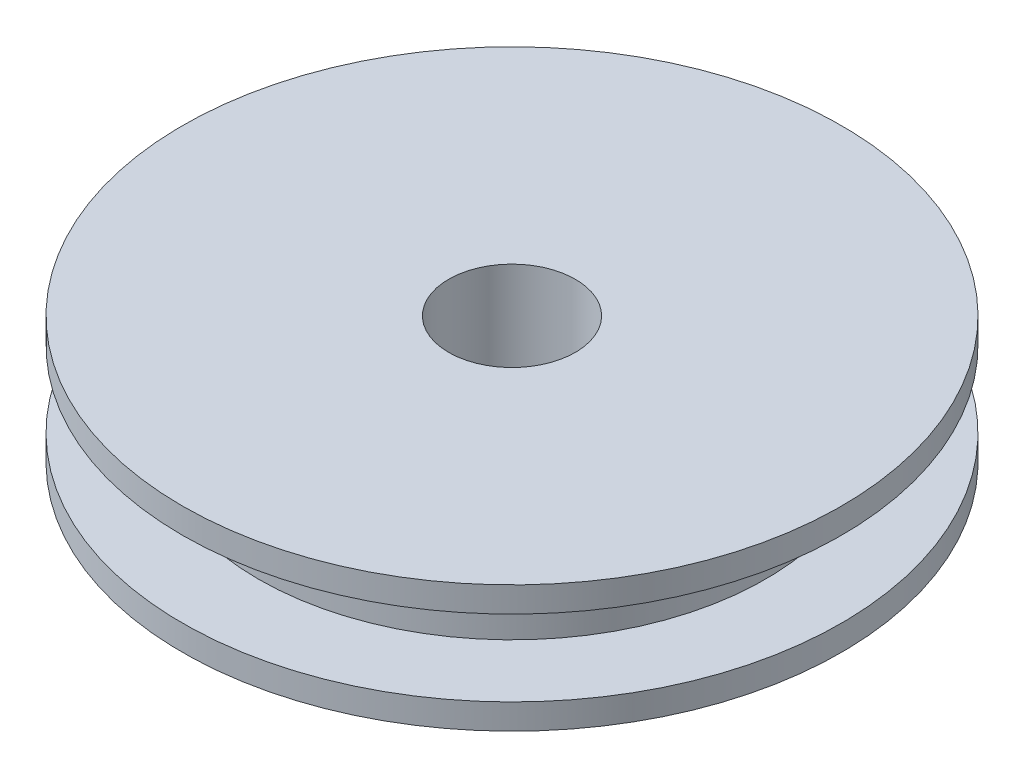
ISO-10303-21;
HEADER;
FILE_DESCRIPTION(('STEP AP214'),'2;1');
FILE_NAME('part.step','',(''),(''),'','','');
FILE_SCHEMA(('AUTOMOTIVE_DESIGN { 1 0 10303 214 1 1 1 1 }'));
ENDSEC;
DATA;
#1=APPLICATION_CONTEXT('core data for automotive mechanical design processes');
#2=APPLICATION_PROTOCOL_DEFINITION('international standard','automotive_design',2000,#1);
#3=PRODUCT_CONTEXT('',#1,'mechanical');
#4=PRODUCT('Part','Part','',(#3));
#5=PRODUCT_RELATED_PRODUCT_CATEGORY('part','',(#4));
#6=PRODUCT_DEFINITION_FORMATION('','',#4);
#7=PRODUCT_DEFINITION_CONTEXT('part definition',#1,'design');
#8=PRODUCT_DEFINITION('design','',#6,#7);
#9=PRODUCT_DEFINITION_SHAPE('','',#8);
#10=(LENGTH_UNIT() NAMED_UNIT(*) SI_UNIT(.MILLI.,.METRE.));
#11=(NAMED_UNIT(*) PLANE_ANGLE_UNIT() SI_UNIT($,.RADIAN.));
#12=(NAMED_UNIT(*) SI_UNIT($,.STERADIAN.) SOLID_ANGLE_UNIT());
#13=UNCERTAINTY_MEASURE_WITH_UNIT(LENGTH_MEASURE(1.E-05),#10,'distance_accuracy_value','');
#14=(GEOMETRIC_REPRESENTATION_CONTEXT(3) GLOBAL_UNCERTAINTY_ASSIGNED_CONTEXT((#13)) GLOBAL_UNIT_ASSIGNED_CONTEXT((#10,
#11,#12)) REPRESENTATION_CONTEXT('',''));
#15=CARTESIAN_POINT('',(0.,0.,0.));
#16=DIRECTION('',(0.,0.,1.));
#17=DIRECTION('',(1.,0.,0.));
#18=AXIS2_PLACEMENT_3D('',#15,#16,#17);
#19=CARTESIAN_POINT('',(0.,1.,0.));
#20=DIRECTION('',(0.,-1.,0.));
#21=DIRECTION('',(0.,0.,-1.));
#22=AXIS2_PLACEMENT_3D('',#19,#20,#21);
#23=CYLINDRICAL_SURFACE('',#22,10.);
#24=CARTESIAN_POINT('',(0.,2.08333333333333,10.));
#25=CARTESIAN_POINT('',(-0.0343918405423154,2.08333425663211,10.000000240665));
#26=CARTESIAN_POINT('',(-0.0687684758567977,2.0861353066438,9.99982110138255));
#27=CARTESIAN_POINT('',(-0.135569010645962,2.09724394657777,9.99913505389116));
#28=CARTESIAN_POINT('',(-0.168020537021735,2.10538301783988,9.99863818778998));
#29=CARTESIAN_POINT('',(-0.231067060183103,2.12720450531789,9.99737964295823));
#30=CARTESIAN_POINT('',(-0.261661198327348,2.14088946320878,9.99661784283137));
#31=CARTESIAN_POINT('',(-0.312236604015932,2.16976815300715,9.99514778735229));
#32=CARTESIAN_POINT('',(-0.33294142373761,2.18369867078747,9.99447496513664));
#33=CARTESIAN_POINT('',(-0.371775183435641,2.21471098780811,9.99310554166539));
#34=CARTESIAN_POINT('',(-0.389912193310051,2.23178250843328,9.99240902384209));
#35=CARTESIAN_POINT('',(-0.4203753402847,2.2661606546136,9.99117022602081));
#36=CARTESIAN_POINT('',(-0.433164451824504,2.2830556294888,9.99062040419207));
#37=CARTESIAN_POINT('',(-0.455735418967818,2.31872363295908,9.98961625670732));
#38=CARTESIAN_POINT('',(-0.465523024765485,2.3374929780329,9.98916174898656));
#39=CARTESIAN_POINT('',(-0.481668859599674,2.37658264627405,9.98839634866069));
#40=CARTESIAN_POINT('',(-0.488008736241563,2.39691062478493,9.98808622585579));
#41=CARTESIAN_POINT('',(-0.496846459003755,2.43838761011626,9.98765056295291));
#42=CARTESIAN_POINT('',(-0.499345257692246,2.45953641204231,9.98752497709104));
#43=CARTESIAN_POINT('',(-0.500385448467233,2.50021755888231,9.98747286038402));
#44=CARTESIAN_POINT('',(-0.499228974536417,2.51974310191324,9.98753113173254));
#45=CARTESIAN_POINT('',(-0.493738053044702,2.55836226110593,9.98780407167143));
#46=CARTESIAN_POINT('',(-0.489399162150791,2.57745523484613,9.98801895892837));
#47=CARTESIAN_POINT('',(-0.477658184068855,2.61518272098965,9.98858736152189));
#48=CARTESIAN_POINT('',(-0.470183354655043,2.63379439440587,9.98894415766662));
#49=CARTESIAN_POINT('',(-0.45252870912274,2.66970028250133,9.98975956530344));
#50=CARTESIAN_POINT('',(-0.44234428104563,2.68699218563122,9.99021835016765));
#51=CARTESIAN_POINT('',(-0.405745285949514,2.74014705675745,9.99179687688918));
#52=CARTESIAN_POINT('',(-0.374701149584311,2.77289468327102,9.99303945570862));
#53=CARTESIAN_POINT('',(-0.299886619634873,2.83281396794417,9.99558107901365));
#54=CARTESIAN_POINT('',(-0.254915720505987,2.85845586750062,9.99686152332652));
#55=CARTESIAN_POINT('',(-0.18046443600173,2.8880415091331,9.99840882771903));
#56=CARTESIAN_POINT('',(-0.152684690509806,2.89657346347264,9.99887459497359));
#57=CARTESIAN_POINT('',(-0.0961438458740754,2.90925953874071,9.9995774543495));
#58=CARTESIAN_POINT('',(-0.0673835244557484,2.91341704945838,9.99981472352363));
#59=CARTESIAN_POINT('',(-0.00711778098514762,2.91748743681278,10.0000466676267));
#60=CARTESIAN_POINT('',(0.0244140131158396,2.91701141188902,10.0000191180778));
#61=CARTESIAN_POINT('',(0.086925580565739,2.91088234190938,9.99967096694745));
#62=CARTESIAN_POINT('',(0.11790607218319,2.9052366265679,9.99935078027533));
#63=CARTESIAN_POINT('',(0.179050212529188,2.8886688482167,9.99844453012022));
#64=CARTESIAN_POINT('',(0.209187947092775,2.87765059093245,9.9978536317294));
#65=CARTESIAN_POINT('',(0.266959631641574,2.85042997219707,9.99647765212517));
#66=CARTESIAN_POINT('',(0.294599151563507,2.83423952754763,9.99569301821606));
#67=CARTESIAN_POINT('',(0.344801102596161,2.79797139174013,9.99408360400923));
#68=CARTESIAN_POINT('',(0.367565119319892,2.77817391486409,9.99326379829392));
#69=CARTESIAN_POINT('',(0.40878324453998,2.73451815392962,9.99166260184777));
#70=CARTESIAN_POINT('',(0.4272461968543,2.71066838007943,9.99088113494583));
#71=CARTESIAN_POINT('',(0.454202249192551,2.66678389813031,9.98968610935136));
#72=CARTESIAN_POINT('',(0.464038612566969,2.64756969178821,9.98923094380837));
#73=CARTESIAN_POINT('',(0.480384579635395,2.60778142934186,9.98845823286531));
#74=CARTESIAN_POINT('',(0.48689859456331,2.58720921755421,9.98814050506849));
#75=CARTESIAN_POINT('',(0.496220902956955,2.54511324415106,9.9876817824229));
#76=CARTESIAN_POINT('',(0.499009259738398,2.52358499518311,9.98754173859338));
#77=CARTESIAN_POINT('',(0.500547959897973,2.48038301338825,9.98746477897818));
#78=CARTESIAN_POINT('',(0.49929996119295,2.45870934394183,9.98752777979268));
#79=CARTESIAN_POINT('',(0.493051127600889,2.41787196221799,9.98783803806299));
#80=CARTESIAN_POINT('',(0.488390224154373,2.39865522030574,9.98806859220266));
#81=CARTESIAN_POINT('',(0.475909974059153,2.36128486890633,9.98867100988628));
#82=CARTESIAN_POINT('',(0.468090753724486,2.34313121693511,9.98904286777888));
#83=CARTESIAN_POINT('',(0.449638655615556,2.30830800418748,9.98989035522735));
#84=CARTESIAN_POINT('',(0.439003376864495,2.29163972612941,9.99036607327356));
#85=CARTESIAN_POINT('',(0.415352195885906,2.26007250036448,9.9913775083935));
#86=CARTESIAN_POINT('',(0.402332332735594,2.24517656555487,9.99191332471103));
#87=CARTESIAN_POINT('',(0.357181740926861,2.20026257773197,9.99366687842542));
#88=CARTESIAN_POINT('',(0.321178303409672,2.17407342496594,9.99491590143385));
#89=CARTESIAN_POINT('',(0.236609035095488,2.1277479663363,9.9973056990682));
#90=CARTESIAN_POINT('',(0.186954520614691,2.10968387862658,9.99838166293073));
#91=CARTESIAN_POINT('',(0.0913029487561987,2.08826173191194,9.99968348434067));
#92=CARTESIAN_POINT('',(0.0456380866477496,2.08333210811279,9.99999968063678));
#93=CARTESIAN_POINT('',(0.,2.08333333333333,10.));
#94=B_SPLINE_CURVE_WITH_KNOTS('',3,(#24,#25,#26,#27,#28,#29,#30,#31,#32,#33,#34,#35,#36,#37,#38,
#39,#40,#41,#42,#43,#44,#45,#46,#47,#48,#49,#50,#51,#52,#53,#54,#55,#56,#57,#58,#59,#60,#61,#62,
#63,#64,#65,#66,#67,#68,#69,#70,#71,#72,#73,#74,#75,#76,#77,#78,#79,#80,#81,#82,#83,#84,#85,#86,
#87,#88,#89,#90,#91,#92,#93),.UNSPECIFIED.,.T.,.F.,(4,2,2,2,2,2,2,2,2,2,2,2,2,2,2,2,2,2,2,2,2,2,
2,2,2,2,2,2,2,2,2,2,2,2,4),(0.,0.103027550230008,0.20294972268587,0.302917741267874,
0.377528323509331,0.451898957763233,0.515221738346625,0.578422438085317,0.641956344146566,
0.70547449157237,0.763883794710688,0.822374805313773,0.88230496817815,0.942337797010061,
1.07569895444588,1.22868566561374,1.31558281984909,1.40241258712466,1.49658902217748,
1.59063213796291,1.68642459305629,1.78199791360014,1.8720231859602,1.96186168211153,
2.02636832474643,2.09078909452871,2.15555322928169,2.22029076580467,2.27933111629612,
2.33836910575574,2.39745759411088,2.45664513674715,2.58833820245963,2.74486117403514,
2.88157907544309),.UNSPECIFIED.);
#95=CARTESIAN_POINT('',(0.,2.08333333333333,10.));
#96=VERTEX_POINT('',#95);
#97=EDGE_CURVE('E71',#96,#96,#94,.T.);
#98=ORIENTED_EDGE('',*,*,#97,.T.);
#99=EDGE_LOOP('',(#98));
#100=FACE_BOUND('',#99,.T.);
#101=CARTESIAN_POINT('',(0.,4.,0.));
#102=DIRECTION('',(0.,1.,0.));
#103=DIRECTION('',(0.,0.,1.));
#104=AXIS2_PLACEMENT_3D('',#101,#102,#103);
#105=CIRCLE('',#104,10.);
#106=CARTESIAN_POINT('',(0.,4.,10.));
#107=VERTEX_POINT('',#106);
#108=EDGE_CURVE('E55',#107,#107,#105,.T.);
#109=ORIENTED_EDGE('',*,*,#108,.F.);
#110=EDGE_LOOP('',(#109));
#111=FACE_BOUND('',#110,.T.);
#112=CARTESIAN_POINT('',(0.,1.,0.));
#113=DIRECTION('',(0.,-1.,0.));
#114=DIRECTION('',(0.,0.,-1.));
#115=AXIS2_PLACEMENT_3D('',#112,#113,#114);
#116=CIRCLE('',#115,10.);
#117=CARTESIAN_POINT('',(0.,1.,-10.));
#118=VERTEX_POINT('',#117);
#119=EDGE_CURVE('E10',#118,#118,#116,.T.);
#120=ORIENTED_EDGE('',*,*,#119,.F.);
#121=EDGE_LOOP('',(#120));
#122=FACE_BOUND('',#121,.T.);
#123=ADVANCED_FACE('F43',(#100,#111,#122),#23,.T.);
#124=CARTESIAN_POINT('',(0.,0.,0.));
#125=DIRECTION('',(0.,1.,0.));
#126=DIRECTION('',(0.,0.,1.));
#127=AXIS2_PLACEMENT_3D('',#124,#125,#126);
#128=PLANE('',#127);
#129=CARTESIAN_POINT('',(0.,0.,7.5));
#130=CARTESIAN_POINT('',(0.0462390736429041,0.,7.49999839587241));
#131=CARTESIAN_POINT('',(0.0924864200573148,0.,7.49352512242986));
#132=CARTESIAN_POINT('',(0.163938358161151,0.,7.47320327223953));
#133=CARTESIAN_POINT('',(0.190306154345912,0.,7.46322328178412));
#134=CARTESIAN_POINT('',(0.241023625012842,0.,7.43897105399718));
#135=CARTESIAN_POINT('',(0.265372375023573,0.,7.42469686415015));
#136=CARTESIAN_POINT('',(0.311300918534582,0.,7.39227798951156));
#137=CARTESIAN_POINT('',(0.332883210717633,0.,7.37413683739742));
#138=CARTESIAN_POINT('',(0.372727006191818,0.,7.3344633485154));
#139=CARTESIAN_POINT('',(0.390983935017271,0.,7.31292641522085));
#140=CARTESIAN_POINT('',(0.423608190375306,0.,7.26710778161505));
#141=CARTESIAN_POINT('',(0.437978244536997,0.,7.24282802314293));
#142=CARTESIAN_POINT('',(0.462438922580153,0.,7.19219947906264));
#143=CARTESIAN_POINT('',(0.472529359594631,0.,7.1658506031672));
#144=CARTESIAN_POINT('',(0.488142902140043,0.,7.11183412009712));
#145=CARTESIAN_POINT('',(0.493666230492309,0.,7.08416657732762));
#146=CARTESIAN_POINT('',(0.499989803084719,0.,7.02829535837555));
#147=CARTESIAN_POINT('',(0.500789792613297,0.,7.00009165336208));
#148=CARTESIAN_POINT('',(0.49764442430675,0.,6.94396985498337));
#149=CARTESIAN_POINT('',(0.493702357062373,0.,6.9160515771068));
#150=CARTESIAN_POINT('',(0.481181695838496,0.,6.86123541199565));
#151=CARTESIAN_POINT('',(0.472596923599696,0.,6.8343389356793));
#152=CARTESIAN_POINT('',(0.451038348807179,0.,6.78238846690866));
#153=CARTESIAN_POINT('',(0.438067572294658,0.,6.75733321860301));
#154=CARTESIAN_POINT('',(0.408103099104854,0.,6.70975478341943));
#155=CARTESIAN_POINT('',(0.391109222077886,0.,6.68723171012197));
#156=CARTESIAN_POINT('',(0.353582248667779,0.,6.64535940965521));
#157=CARTESIAN_POINT('',(0.333049328502669,0.,6.62601002455341));
#158=CARTESIAN_POINT('',(0.289025265875134,0.,6.59103199491655));
#159=CARTESIAN_POINT('',(0.265533961591862,0.,6.57540355404893));
#160=CARTESIAN_POINT('',(0.216277533008077,0.,6.54832155528476));
#161=CARTESIAN_POINT('',(0.190513940067303,0.,6.53686521199822));
#162=CARTESIAN_POINT('',(0.13739556953862,0.,6.51842565021313));
#163=CARTESIAN_POINT('',(0.110038791587036,0.,6.51144819337958));
#164=CARTESIAN_POINT('',(0.0545597606639465,0.,6.50219116420192));
#165=CARTESIAN_POINT('',(0.0264380096792795,0.,6.49990858292994));
#166=CARTESIAN_POINT('',(-0.0297895602258084,0.,6.50009703353133));
#167=CARTESIAN_POINT('',(-0.0578953791462292,0.,6.50256806540474));
#168=CARTESIAN_POINT('',(-0.113311113236169,0.,6.51219676607889));
#169=CARTESIAN_POINT('',(-0.140620506261096,0.,6.51935744037505));
#170=CARTESIAN_POINT('',(-0.193614081891374,0.,6.53815264370888));
#171=CARTESIAN_POINT('',(-0.219300303436268,0.,6.54978142461957));
#172=CARTESIAN_POINT('',(-0.268374093085131,0.,6.57719298393516));
#173=CARTESIAN_POINT('',(-0.291760111192628,0.,6.59297853740357));
#174=CARTESIAN_POINT('',(-0.335548724832065,0.,6.62825087731775));
#175=CARTESIAN_POINT('',(-0.355951483547693,0.,6.64773746118376));
#176=CARTESIAN_POINT('',(-0.393196941193438,0.,6.6898603666357));
#177=CARTESIAN_POINT('',(-0.410039462850237,0.,6.71249684496993));
#178=CARTESIAN_POINT('',(-0.439684341593696,0.,6.76027506503056));
#179=CARTESIAN_POINT('',(-0.452486879787,0.,6.78541669438814));
#180=CARTESIAN_POINT('',(-0.473696742983465,0.,6.83751050458682));
#181=CARTESIAN_POINT('',(-0.482101033589213,0.,6.86446392096982));
#182=CARTESIAN_POINT('',(-0.494253977245832,0.,6.91936278137501));
#183=CARTESIAN_POINT('',(-0.498008817888138,0.,6.94730685592098));
#184=CARTESIAN_POINT('',(-0.500777927661379,0.,7.00344847655034));
#185=CARTESIAN_POINT('',(-0.499788905119809,0.,7.03164618507992));
#186=CARTESIAN_POINT('',(-0.493090965958272,0.,7.08747376144188));
#187=CARTESIAN_POINT('',(-0.487382303676313,0.,7.11510365979092));
#188=CARTESIAN_POINT('',(-0.471407037316291,0.,7.16901427276502));
#189=CARTESIAN_POINT('',(-0.461140210756561,0.,7.19529492146403));
#190=CARTESIAN_POINT('',(-0.436340708865529,0.,7.2457583649462));
#191=CARTESIAN_POINT('',(-0.42180822013208,0.,7.26994125143429));
#192=CARTESIAN_POINT('',(-0.38887757399113,0.,7.31554021153062));
#193=CARTESIAN_POINT('',(-0.37047669624999,0.,7.33695432086987));
#194=CARTESIAN_POINT('',(-0.330367758512933,0.,7.37635981191031));
#195=CARTESIAN_POINT('',(-0.308664252061271,0.,7.39435583070094));
#196=CARTESIAN_POINT('',(-0.262518930141485,0.,7.42646678815502));
#197=CARTESIAN_POINT('',(-0.238074531600847,0.,7.44057802171259));
#198=CARTESIAN_POINT('',(-0.187194161438021,0.,7.46448912327469));
#199=CARTESIAN_POINT('',(-0.160759256422821,0.,7.47429128129763));
#200=CARTESIAN_POINT('',(-0.0902487003250903,0.,7.49383865999402));
#201=CARTESIAN_POINT('',(-0.045128290201748,0.,7.50000156559224));
#202=CARTESIAN_POINT('',(0.,0.,7.5));
#203=B_SPLINE_CURVE_WITH_KNOTS('',3,(#129,#130,#131,#132,#133,#134,#135,#136,#137,#138,#139,
#140,#141,#142,#143,#144,#145,#146,#147,#148,#149,#150,#151,#152,#153,#154,#155,#156,#157,#158,
#159,#160,#161,#162,#163,#164,#165,#166,#167,#168,#169,#170,#171,#172,#173,#174,#175,#176,#177,
#178,#179,#180,#181,#182,#183,#184,#185,#186,#187,#188,#189,#190,#191,#192,#193,#194,#195,#196,
#197,#198,#199,#200,#201,#202),.UNSPECIFIED.,.T.,.F.,(4,2,2,2,2,2,2,2,2,2,2,2,2,2,2,2,2,2,2,2,2,
2,2,2,2,2,2,2,2,2,2,2,2,2,2,2,4),(0.,0.138209846293362,0.222432968830604,0.306694444533051,
0.390879270263393,0.47517904255985,0.559419502778288,0.643663640928671,0.727903668710718,
0.81214823919323,0.896334384697033,0.980632837208026,1.06487324785223,1.1491174355856,
1.2333574297961,1.31760203385858,1.40179029069316,1.48608663188406,1.57032893101543,
1.65457123014725,1.73886757133833,1.82305582817318,1.90730043225384,1.99154042644632,
2.07578461417624,2.16002502482381,2.24432347745586,2.32850962283766,2.41275419176188,
2.49699422110247,2.58123836260791,2.66547881947231,2.74977871537628,2.83396341749783,
2.91822813461395,3.00244801572705,3.13733770016222),.UNSPECIFIED.);
#204=CARTESIAN_POINT('',(0.,0.,7.5));
#205=VERTEX_POINT('',#204);
#206=EDGE_CURVE('E67',#205,#205,#203,.T.);
#207=ORIENTED_EDGE('',*,*,#206,.T.);
#208=EDGE_LOOP('',(#207));
#209=FACE_BOUND('',#208,.T.);
#210=CARTESIAN_POINT('',(0.,0.,0.));
#211=DIRECTION('',(0.,1.,0.));
#212=DIRECTION('',(0.,0.,1.));
#213=AXIS2_PLACEMENT_3D('',#210,#211,#212);
#214=CIRCLE('',#213,1.);
#215=CARTESIAN_POINT('',(0.,0.,1.));
#216=VERTEX_POINT('',#215);
#217=EDGE_CURVE('E117',#216,#216,#214,.T.);
#218=ORIENTED_EDGE('',*,*,#217,.T.);
#219=EDGE_LOOP('',(#218));
#220=FACE_BOUND('',#219,.T.);
#221=CARTESIAN_POINT('',(0.,0.,0.));
#222=DIRECTION('',(0.,-1.,0.));
#223=DIRECTION('',(0.,0.,-1.));
#224=AXIS2_PLACEMENT_3D('',#221,#222,#223);
#225=CIRCLE('',#224,13.);
#226=CARTESIAN_POINT('',(0.,0.,-13.));
#227=VERTEX_POINT('',#226);
#228=EDGE_CURVE('E120',#227,#227,#225,.T.);
#229=ORIENTED_EDGE('',*,*,#228,.T.);
#230=EDGE_LOOP('',(#229));
#231=FACE_BOUND('',#230,.T.);
#232=ADVANCED_FACE('F102',(#209,#220,#231),#128,.F.);
#233=CARTESIAN_POINT('',(0.,5.,0.));
#234=DIRECTION('',(0.,-1.,0.));
#235=DIRECTION('',(0.,0.,-1.));
#236=AXIS2_PLACEMENT_3D('',#233,#234,#235);
#237=CYLINDRICAL_SURFACE('',#236,13.);
#238=CARTESIAN_POINT('',(0.,5.,0.));
#239=DIRECTION('',(0.,1.,0.));
#240=DIRECTION('',(0.,0.,1.));
#241=AXIS2_PLACEMENT_3D('',#238,#239,#240);
#242=CIRCLE('',#241,13.);
#243=CARTESIAN_POINT('',(0.,5.,13.));
#244=VERTEX_POINT('',#243);
#245=EDGE_CURVE('E60',#244,#244,#242,.T.);
#246=ORIENTED_EDGE('',*,*,#245,.F.);
#247=EDGE_LOOP('',(#246));
#248=FACE_BOUND('',#247,.T.);
#249=CARTESIAN_POINT('',(0.,4.,0.));
#250=DIRECTION('',(0.,1.,0.));
#251=DIRECTION('',(0.,0.,1.));
#252=AXIS2_PLACEMENT_3D('',#249,#250,#251);
#253=CIRCLE('',#252,13.);
#254=CARTESIAN_POINT('',(0.,4.,13.));
#255=VERTEX_POINT('',#254);
#256=EDGE_CURVE('E63',#255,#255,#253,.T.);
#257=ORIENTED_EDGE('',*,*,#256,.T.);
#258=EDGE_LOOP('',(#257));
#259=FACE_BOUND('',#258,.T.);
#260=ADVANCED_FACE('F96',(#248,#259),#237,.T.);
#261=CARTESIAN_POINT('',(0.,5.,0.));
#262=DIRECTION('',(0.,1.,0.));
#263=DIRECTION('',(0.,0.,1.));
#264=AXIS2_PLACEMENT_3D('',#261,#262,#263);
#265=PLANE('',#264);
#266=CARTESIAN_POINT('',(0.,5.,0.));
#267=DIRECTION('',(0.,1.,0.));
#268=DIRECTION('',(0.,0.,1.));
#269=AXIS2_PLACEMENT_3D('',#266,#267,#268);
#270=CIRCLE('',#269,2.5);
#271=CARTESIAN_POINT('',(0.,5.,2.5));
#272=VERTEX_POINT('',#271);
#273=EDGE_CURVE('E80',#272,#272,#270,.T.);
#274=ORIENTED_EDGE('',*,*,#273,.F.);
#275=EDGE_LOOP('',(#274));
#276=FACE_BOUND('',#275,.T.);
#277=ORIENTED_EDGE('',*,*,#245,.T.);
#278=EDGE_LOOP('',(#277));
#279=FACE_BOUND('',#278,.T.);
#280=ADVANCED_FACE('F92',(#276,#279),#265,.T.);
#281=CARTESIAN_POINT('',(0.,4.,0.));
#282=DIRECTION('',(0.,1.,0.));
#283=DIRECTION('',(0.,0.,1.));
#284=AXIS2_PLACEMENT_3D('',#281,#282,#283);
#285=PLANE('',#284);
#286=ORIENTED_EDGE('',*,*,#108,.T.);
#287=EDGE_LOOP('',(#286));
#288=FACE_BOUND('',#287,.T.);
#289=ORIENTED_EDGE('',*,*,#256,.F.);
#290=EDGE_LOOP('',(#289));
#291=FACE_BOUND('',#290,.T.);
#292=ADVANCED_FACE('F95',(#288,#291),#285,.F.);
#293=CARTESIAN_POINT('',(0.,3.78051215448054,12.0366145853767));
#294=CARTESIAN_POINT('',(0.,-1.1284038755815,6.1459153493022));
#295=CARTESIAN_POINT('',(1.,3.78051215448054,12.0366145853767));
#296=CARTESIAN_POINT('',(1.,-1.1284038755815,6.1459153493022));
#297=CARTESIAN_POINT('',(1.,3.78051215448054,11.0366145853767));
#298=CARTESIAN_POINT('',(1.,-1.1284038755815,5.1459153493022));
#299=CARTESIAN_POINT('',(0.,3.78051215448054,11.0366145853767));
#300=CARTESIAN_POINT('',(0.,-1.1284038755815,5.1459153493022));
#301=CARTESIAN_POINT('',(-1.,3.78051215448054,11.0366145853767));
#302=CARTESIAN_POINT('',(-1.,-1.1284038755815,5.1459153493022));
#303=CARTESIAN_POINT('',(-1.,3.78051215448054,12.0366145853767));
#304=CARTESIAN_POINT('',(-1.,-1.1284038755815,6.1459153493022));
#305=CARTESIAN_POINT('',(0.,3.78051215448054,12.0366145853767));
#306=CARTESIAN_POINT('',(0.,-1.1284038755815,6.1459153493022));
#307=(BOUNDED_SURFACE() B_SPLINE_SURFACE(3,1,((#293,#294),(#295,#296),(#297,#298),(#299,#300),
(#301,#302),(#303,#304),(#305,#306)),.UNSPECIFIED.,.T.,.F.,.F.) B_SPLINE_SURFACE_WITH_KNOTS((4,
3,4),(2,2),(0.,0.5,1.),(0.,1.),
.UNSPECIFIED.) GEOMETRIC_REPRESENTATION_ITEM() RATIONAL_B_SPLINE_SURFACE(((1.,1.),
(0.333333333333333,0.333333333333333),(0.333333333333333,0.333333333333333),(1.,1.),
(0.333333333333333,0.333333333333333),(0.333333333333333,0.333333333333333),(1.,1.))) REPRESENTATION_ITEM('') SURFACE());
#308=CARTESIAN_POINT('',(0.,2.08333333333333,10.));
#309=CARTESIAN_POINT('',(0.,2.06163194444445,9.97395833333333));
#310=CARTESIAN_POINT('',(0.,2.03993055555556,9.94791666666667));
#311=CARTESIAN_POINT('',(0.,1.99652777777778,9.89583333333333));
#312=CARTESIAN_POINT('',(0.,1.97482638888889,9.86979166666667));
#313=CARTESIAN_POINT('',(0.,1.93142361111111,9.81770833333333));
#314=CARTESIAN_POINT('',(0.,1.90972222222222,9.79166666666667));
#315=CARTESIAN_POINT('',(0.,1.86631944444444,9.73958333333333));
#316=CARTESIAN_POINT('',(0.,1.84461805555556,9.71354166666667));
#317=CARTESIAN_POINT('',(0.,1.80121527777778,9.66145833333333));
#318=CARTESIAN_POINT('',(0.,1.77951388888889,9.63541666666667));
#319=CARTESIAN_POINT('',(0.,1.73611111111111,9.58333333333333));
#320=CARTESIAN_POINT('',(0.,1.71440972222222,9.55729166666667));
#321=CARTESIAN_POINT('',(0.,1.67100694444444,9.50520833333333));
#322=CARTESIAN_POINT('',(0.,1.64930555555556,9.47916666666667));
#323=CARTESIAN_POINT('',(0.,1.60590277777778,9.42708333333333));
#324=CARTESIAN_POINT('',(0.,1.58420138888889,9.40104166666667));
#325=CARTESIAN_POINT('',(0.,1.54079861111111,9.34895833333333));
#326=CARTESIAN_POINT('',(0.,1.51909722222222,9.32291666666667));
#327=CARTESIAN_POINT('',(0.,1.47569444444444,9.27083333333333));
#328=CARTESIAN_POINT('',(0.,1.45399305555556,9.24479166666667));
#329=CARTESIAN_POINT('',(0.,1.41059027777778,9.19270833333333));
#330=CARTESIAN_POINT('',(0.,1.38888888888889,9.16666666666667));
#331=CARTESIAN_POINT('',(0.,1.34548611111111,9.11458333333333));
#332=CARTESIAN_POINT('',(0.,1.32378472222222,9.08854166666667));
#333=CARTESIAN_POINT('',(0.,1.28038194444444,9.03645833333333));
#334=CARTESIAN_POINT('',(0.,1.25868055555556,9.01041666666667));
#335=CARTESIAN_POINT('',(0.,1.21527777777778,8.95833333333333));
#336=CARTESIAN_POINT('',(0.,1.19357638888889,8.93229166666667));
#337=CARTESIAN_POINT('',(0.,1.15017361111111,8.88020833333333));
#338=CARTESIAN_POINT('',(0.,1.12847222222222,8.85416666666667));
#339=CARTESIAN_POINT('',(0.,1.08506944444444,8.80208333333333));
#340=CARTESIAN_POINT('',(0.,1.06336805555556,8.77604166666667));
#341=CARTESIAN_POINT('',(0.,1.01996527777778,8.72395833333333));
#342=CARTESIAN_POINT('',(0.,0.998263888888889,8.69791666666667));
#343=CARTESIAN_POINT('',(0.,0.954861111111111,8.64583333333333));
#344=CARTESIAN_POINT('',(0.,0.933159722222222,8.61979166666667));
#345=CARTESIAN_POINT('',(0.,0.889756944444445,8.56770833333333));
#346=CARTESIAN_POINT('',(0.,0.868055555555556,8.54166666666667));
#347=CARTESIAN_POINT('',(0.,0.824652777777778,8.48958333333333));
#348=CARTESIAN_POINT('',(0.,0.802951388888889,8.46354166666667));
#349=CARTESIAN_POINT('',(0.,0.759548611111111,8.41145833333333));
#350=CARTESIAN_POINT('',(0.,0.737847222222222,8.38541666666667));
#351=CARTESIAN_POINT('',(0.,0.694444444444444,8.33333333333333));
#352=CARTESIAN_POINT('',(0.,0.672743055555555,8.30729166666667));
#353=CARTESIAN_POINT('',(0.,0.629340277777778,8.25520833333333));
#354=CARTESIAN_POINT('',(0.,0.607638888888889,8.22916666666667));
#355=CARTESIAN_POINT('',(0.,0.564236111111111,8.17708333333333));
#356=CARTESIAN_POINT('',(0.,0.542534722222222,8.15104166666667));
#357=CARTESIAN_POINT('',(0.,0.499131944444444,8.09895833333333));
#358=CARTESIAN_POINT('',(0.,0.477430555555556,8.07291666666667));
#359=CARTESIAN_POINT('',(0.,0.434027777777778,8.02083333333333));
#360=CARTESIAN_POINT('',(0.,0.412326388888889,7.99479166666667));
#361=CARTESIAN_POINT('',(0.,0.368923611111111,7.94270833333333));
#362=CARTESIAN_POINT('',(0.,0.347222222222221,7.91666666666667));
#363=CARTESIAN_POINT('',(0.,0.303819444444444,7.86458333333333));
#364=CARTESIAN_POINT('',(0.,0.282118055555555,7.83854166666667));
#365=CARTESIAN_POINT('',(0.,0.238715277777778,7.78645833333333));
#366=CARTESIAN_POINT('',(0.,0.217013888888889,7.76041666666666));
#367=CARTESIAN_POINT('',(0.,0.17361111111111,7.70833333333333));
#368=CARTESIAN_POINT('',(0.,0.151909722222222,7.68229166666666));
#369=CARTESIAN_POINT('',(0.,0.108506944444444,7.63020833333333));
#370=CARTESIAN_POINT('',(0.,0.0868055555555554,7.60416666666666));
#371=CARTESIAN_POINT('',(0.,0.0434027777777777,7.55208333333333));
#372=CARTESIAN_POINT('',(0.,0.0217013888888886,7.52604166666666));
#373=CARTESIAN_POINT('',(0.,0.,7.5));
#374=B_SPLINE_CURVE_WITH_KNOTS('',3,(#308,#309,#310,#311,#312,#313,#314,#315,#316,#317,#318,
#319,#320,#321,#322,#323,#324,#325,#326,#327,#328,#329,#330,#331,#332,#333,#334,#335,#336,#337,
#338,#339,#340,#341,#342,#343,#344,#345,#346,#347,#348,#349,#350,#351,#352,#353,#354,#355,#356,
#357,#358,#359,#360,#361,#362,#363,#364,#365,#366,#367,#368,#369,#370,#371,#372,#373),
.UNSPECIFIED.,.F.,.F.,(4,2,2,2,2,2,2,2,2,2,2,2,2,2,2,2,2,2,2,2,2,2,2,2,2,2,2,2,2,2,2,2,4),(0.,
0.101695959321701,0.203391918643403,0.305087877965104,0.406783837286804,0.508479796608507,
0.610175755930208,0.711871715251909,0.81356767457361,0.915263633895312,1.01695959321701,
1.11865555253871,1.22035151186042,1.32204747118212,1.42374343050382,1.52543938982552,
1.62713534914722,1.72883130846892,1.83052726779062,1.93222322711232,2.03391918643403,
2.13561514575573,2.23731110507743,2.33900706439913,2.44070302372083,2.54239898304253,
2.64409494236423,2.74579090168594,2.84748686100764,2.94918282032934,3.05087877965104,
3.15257473897274,3.25427069829444),.UNSPECIFIED.);
#375=EDGE_CURVE('BSEAM86',#96,#205,#374,.T.);
#376=ORIENTED_EDGE('',*,*,#97,.F.);
#377=ORIENTED_EDGE('',*,*,#206,.F.);
#378=ORIENTED_EDGE('',*,*,#375,.T.);
#379=ORIENTED_EDGE('',*,*,#375,.F.);
#380=EDGE_LOOP('',(#376,#378,#377,#379));
#381=FACE_BOUND('',#380,.T.);
#382=ADVANCED_FACE('F86',(#381),#307,.T.);
#383=CARTESIAN_POINT('',(0.,5.,0.));
#384=DIRECTION('',(0.,-1.,0.));
#385=DIRECTION('',(0.,0.,-1.));
#386=AXIS2_PLACEMENT_3D('',#383,#384,#385);
#387=CYLINDRICAL_SURFACE('',#386,2.5);
#388=CARTESIAN_POINT('',(0.,1.,0.));
#389=DIRECTION('',(0.,1.,0.));
#390=DIRECTION('',(0.,0.,1.));
#391=AXIS2_PLACEMENT_3D('',#388,#389,#390);
#392=CIRCLE('',#391,2.5);
#393=CARTESIAN_POINT('',(0.,1.,2.5));
#394=VERTEX_POINT('',#393);
#395=EDGE_CURVE('E50',#394,#394,#392,.T.);
#396=ORIENTED_EDGE('',*,*,#395,.F.);
#397=EDGE_LOOP('',(#396));
#398=FACE_BOUND('',#397,.T.);
#399=ORIENTED_EDGE('',*,*,#273,.T.);
#400=EDGE_LOOP('',(#399));
#401=FACE_BOUND('',#400,.T.);
#402=ADVANCED_FACE('F138',(#398,#401),#387,.F.);
#403=CARTESIAN_POINT('',(0.,1.,0.));
#404=DIRECTION('',(0.,1.,0.));
#405=DIRECTION('',(0.,0.,1.));
#406=AXIS2_PLACEMENT_3D('',#403,#404,#405);
#407=PLANE('',#406);
#408=ORIENTED_EDGE('',*,*,#395,.T.);
#409=EDGE_LOOP('',(#408));
#410=FACE_BOUND('',#409,.T.);
#411=CARTESIAN_POINT('',(0.,1.,0.));
#412=DIRECTION('',(0.,1.,0.));
#413=DIRECTION('',(0.,0.,1.));
#414=AXIS2_PLACEMENT_3D('',#411,#412,#413);
#415=CIRCLE('',#414,1.);
#416=CARTESIAN_POINT('',(0.,1.,1.));
#417=VERTEX_POINT('',#416);
#418=EDGE_CURVE('E129',#417,#417,#415,.T.);
#419=ORIENTED_EDGE('',*,*,#418,.F.);
#420=EDGE_LOOP('',(#419));
#421=FACE_BOUND('',#420,.T.);
#422=ADVANCED_FACE('F145',(#410,#421),#407,.T.);
#423=CARTESIAN_POINT('',(0.,1.,0.));
#424=DIRECTION('',(0.,-1.,0.));
#425=DIRECTION('',(0.,0.,-1.));
#426=AXIS2_PLACEMENT_3D('',#423,#424,#425);
#427=CYLINDRICAL_SURFACE('',#426,1.);
#428=ORIENTED_EDGE('',*,*,#418,.T.);
#429=EDGE_LOOP('',(#428));
#430=FACE_BOUND('',#429,.T.);
#431=ORIENTED_EDGE('',*,*,#217,.F.);
#432=EDGE_LOOP('',(#431));
#433=FACE_BOUND('',#432,.T.);
#434=ADVANCED_FACE('F151',(#430,#433),#427,.F.);
#435=CARTESIAN_POINT('',(0.,1.,0.));
#436=DIRECTION('',(0.,-1.,0.));
#437=DIRECTION('',(0.,0.,-1.));
#438=AXIS2_PLACEMENT_3D('',#435,#436,#437);
#439=CYLINDRICAL_SURFACE('',#438,13.);
#440=CARTESIAN_POINT('',(0.,1.,0.));
#441=DIRECTION('',(0.,-1.,0.));
#442=DIRECTION('',(0.,0.,-1.));
#443=AXIS2_PLACEMENT_3D('',#440,#441,#442);
#444=CIRCLE('',#443,13.);
#445=CARTESIAN_POINT('',(0.,1.,-13.));
#446=VERTEX_POINT('',#445);
#447=EDGE_CURVE('E123',#446,#446,#444,.T.);
#448=ORIENTED_EDGE('',*,*,#447,.T.);
#449=EDGE_LOOP('',(#448));
#450=FACE_BOUND('',#449,.T.);
#451=ORIENTED_EDGE('',*,*,#228,.F.);
#452=EDGE_LOOP('',(#451));
#453=FACE_BOUND('',#452,.T.);
#454=ADVANCED_FACE('F159',(#450,#453),#439,.T.);
#455=CARTESIAN_POINT('',(0.,1.,0.));
#456=DIRECTION('',(0.,-1.,0.));
#457=DIRECTION('',(0.,0.,-1.));
#458=AXIS2_PLACEMENT_3D('',#455,#456,#457);
#459=PLANE('',#458);
#460=ORIENTED_EDGE('',*,*,#119,.T.);
#461=EDGE_LOOP('',(#460));
#462=FACE_BOUND('',#461,.T.);
#463=ORIENTED_EDGE('',*,*,#447,.F.);
#464=EDGE_LOOP('',(#463));
#465=FACE_BOUND('',#464,.T.);
#466=ADVANCED_FACE('F162',(#462,#465),#459,.F.);
#467=CLOSED_SHELL('',(#123,#232,#260,#280,#292,#382,#402,#422,#434,#454,#466));
#468=MANIFOLD_SOLID_BREP('B2',#467);
#469=ADVANCED_BREP_SHAPE_REPRESENTATION('',(#18,#468),#14);
#470=SHAPE_DEFINITION_REPRESENTATION(#9,#469);
ENDSEC;
END-ISO-10303-21;
